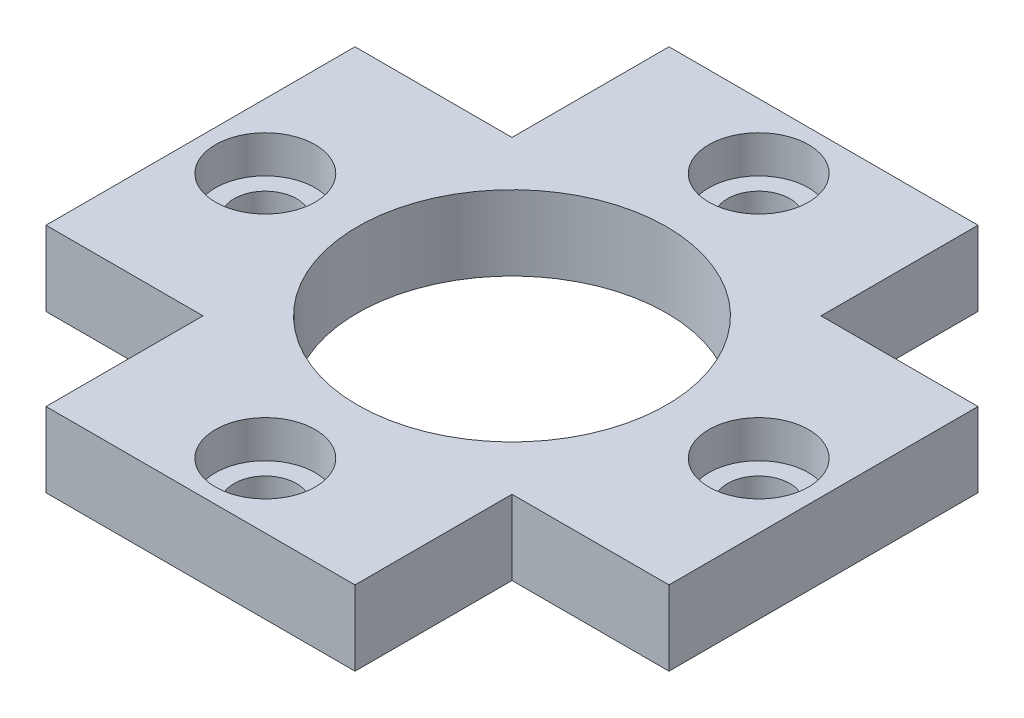
ISO-10303-21;
HEADER;
FILE_DESCRIPTION(('STEP AP214'),'2;1');
FILE_NAME('part.step','',(''),(''),'','','');
FILE_SCHEMA(('AUTOMOTIVE_DESIGN { 1 0 10303 214 1 1 1 1 }'));
ENDSEC;
DATA;
#1=APPLICATION_CONTEXT('core data for automotive mechanical design processes');
#2=APPLICATION_PROTOCOL_DEFINITION('international standard','automotive_design',2000,#1);
#3=PRODUCT_CONTEXT('',#1,'mechanical');
#4=PRODUCT('Part','Part','',(#3));
#5=PRODUCT_RELATED_PRODUCT_CATEGORY('part','',(#4));
#6=PRODUCT_DEFINITION_FORMATION('','',#4);
#7=PRODUCT_DEFINITION_CONTEXT('part definition',#1,'design');
#8=PRODUCT_DEFINITION('design','',#6,#7);
#9=PRODUCT_DEFINITION_SHAPE('','',#8);
#10=(LENGTH_UNIT() NAMED_UNIT(*) SI_UNIT(.MILLI.,.METRE.));
#11=(NAMED_UNIT(*) PLANE_ANGLE_UNIT() SI_UNIT($,.RADIAN.));
#12=(NAMED_UNIT(*) SI_UNIT($,.STERADIAN.) SOLID_ANGLE_UNIT());
#13=UNCERTAINTY_MEASURE_WITH_UNIT(LENGTH_MEASURE(1.E-05),#10,'distance_accuracy_value','');
#14=(GEOMETRIC_REPRESENTATION_CONTEXT(3) GLOBAL_UNCERTAINTY_ASSIGNED_CONTEXT((#13)) GLOBAL_UNIT_ASSIGNED_CONTEXT((#10,
#11,#12)) REPRESENTATION_CONTEXT('',''));
#15=CARTESIAN_POINT('',(0.,0.,0.));
#16=DIRECTION('',(0.,0.,1.));
#17=DIRECTION('',(1.,0.,0.));
#18=AXIS2_PLACEMENT_3D('',#15,#16,#17);
#19=CARTESIAN_POINT('',(0.,3.,-9.89949493661166));
#20=DIRECTION('',(0.,-1.,0.));
#21=DIRECTION('',(0.,0.,-1.));
#22=AXIS2_PLACEMENT_3D('',#19,#20,#21);
#23=CYLINDRICAL_SURFACE('',#22,1.25);
#24=CARTESIAN_POINT('',(0.,0.,-9.89949493661166));
#25=DIRECTION('',(0.,-1.,0.));
#26=DIRECTION('',(-1.,0.,0.));
#27=AXIS2_PLACEMENT_3D('',#24,#25,#26);
#28=CIRCLE('',#27,1.25);
#29=CARTESIAN_POINT('',(-1.25000000000002,0.,-9.89949493661168));
#30=VERTEX_POINT('',#29);
#31=EDGE_CURVE('E227',#30,#30,#28,.T.);
#32=ORIENTED_EDGE('',*,*,#31,.T.);
#33=EDGE_LOOP('',(#32));
#34=FACE_BOUND('',#33,.T.);
#35=CARTESIAN_POINT('',(0.,1.5,-9.89949493661166));
#36=DIRECTION('',(0.,1.,0.));
#37=DIRECTION('',(0.,0.,1.));
#38=AXIS2_PLACEMENT_3D('',#35,#36,#37);
#39=CIRCLE('',#38,1.25);
#40=CARTESIAN_POINT('',(0.,1.5,-8.64949493661166));
#41=VERTEX_POINT('',#40);
#42=EDGE_CURVE('E45',#41,#41,#39,.F.);
#43=ORIENTED_EDGE('',*,*,#42,.F.);
#44=EDGE_LOOP('',(#43));
#45=FACE_BOUND('',#44,.T.);
#46=ADVANCED_FACE('F41',(#34,#45),#23,.F.);
#47=CARTESIAN_POINT('',(-9.89949493661166,3.,1.21335097081698E-13));
#48=DIRECTION('',(0.,-1.,0.));
#49=DIRECTION('',(0.,0.,-1.));
#50=AXIS2_PLACEMENT_3D('',#47,#48,#49);
#51=CYLINDRICAL_SURFACE('',#50,1.25);
#52=CARTESIAN_POINT('',(-9.89949493661166,0.,1.21335097081698E-13));
#53=DIRECTION('',(0.,-1.,0.));
#54=DIRECTION('',(0.,0.,1.));
#55=AXIS2_PLACEMENT_3D('',#52,#53,#54);
#56=CIRCLE('',#55,1.25);
#57=CARTESIAN_POINT('',(-9.89949493661166,0.,1.25000000000012));
#58=VERTEX_POINT('',#57);
#59=EDGE_CURVE('E231',#58,#58,#56,.T.);
#60=ORIENTED_EDGE('',*,*,#59,.T.);
#61=EDGE_LOOP('',(#60));
#62=FACE_BOUND('',#61,.T.);
#63=CARTESIAN_POINT('',(-9.89949493661166,1.5,1.21335097081698E-13));
#64=DIRECTION('',(0.,1.,0.));
#65=DIRECTION('',(0.,0.,1.));
#66=AXIS2_PLACEMENT_3D('',#63,#64,#65);
#67=CIRCLE('',#66,1.25);
#68=CARTESIAN_POINT('',(-9.89949493661166,1.5,1.25000000000012));
#69=VERTEX_POINT('',#68);
#70=EDGE_CURVE('E221',#69,#69,#67,.F.);
#71=ORIENTED_EDGE('',*,*,#70,.F.);
#72=EDGE_LOOP('',(#71));
#73=FACE_BOUND('',#72,.T.);
#74=ADVANCED_FACE('F292',(#62,#73),#51,.F.);
#75=CARTESIAN_POINT('',(0.,3.,9.89949493661166));
#76=DIRECTION('',(0.,-1.,0.));
#77=DIRECTION('',(0.,0.,-1.));
#78=AXIS2_PLACEMENT_3D('',#75,#76,#77);
#79=CYLINDRICAL_SURFACE('',#78,1.25);
#80=CARTESIAN_POINT('',(0.,0.,9.89949493661166));
#81=DIRECTION('',(0.,-1.,0.));
#82=DIRECTION('',(1.,0.,0.));
#83=AXIS2_PLACEMENT_3D('',#80,#81,#82);
#84=CIRCLE('',#83,1.25);
#85=CARTESIAN_POINT('',(1.25000000000009,0.,9.89949493661167));
#86=VERTEX_POINT('',#85);
#87=EDGE_CURVE('E236',#86,#86,#84,.T.);
#88=ORIENTED_EDGE('',*,*,#87,.T.);
#89=EDGE_LOOP('',(#88));
#90=FACE_BOUND('',#89,.T.);
#91=CARTESIAN_POINT('',(0.,1.5,9.89949493661166));
#92=DIRECTION('',(0.,1.,0.));
#93=DIRECTION('',(0.,0.,1.));
#94=AXIS2_PLACEMENT_3D('',#91,#92,#93);
#95=CIRCLE('',#94,1.25);
#96=CARTESIAN_POINT('',(0.,1.5,11.1494949366117));
#97=VERTEX_POINT('',#96);
#98=EDGE_CURVE('E219',#97,#97,#95,.F.);
#99=ORIENTED_EDGE('',*,*,#98,.F.);
#100=EDGE_LOOP('',(#99));
#101=FACE_BOUND('',#100,.T.);
#102=ADVANCED_FACE('F297',(#90,#101),#79,.F.);
#103=CARTESIAN_POINT('',(9.89949493661166,3.,-1.21335097081698E-13));
#104=DIRECTION('',(0.,-1.,0.));
#105=DIRECTION('',(0.,0.,-1.));
#106=AXIS2_PLACEMENT_3D('',#103,#104,#105);
#107=CYLINDRICAL_SURFACE('',#106,1.25);
#108=CARTESIAN_POINT('',(9.89949493661166,0.,-1.21335097081698E-13));
#109=DIRECTION('',(0.,-1.,0.));
#110=DIRECTION('',(0.,0.,-1.));
#111=AXIS2_PLACEMENT_3D('',#108,#109,#110);
#112=CIRCLE('',#111,1.25);
#113=CARTESIAN_POINT('',(9.89949493661166,0.,-1.25000000000012));
#114=VERTEX_POINT('',#113);
#115=EDGE_CURVE('E167',#114,#114,#112,.T.);
#116=ORIENTED_EDGE('',*,*,#115,.T.);
#117=EDGE_LOOP('',(#116));
#118=FACE_BOUND('',#117,.T.);
#119=CARTESIAN_POINT('',(9.89949493661166,1.5,-1.21335097081698E-13));
#120=DIRECTION('',(0.,1.,0.));
#121=DIRECTION('',(0.,0.,1.));
#122=AXIS2_PLACEMENT_3D('',#119,#120,#121);
#123=CIRCLE('',#122,1.25);
#124=CARTESIAN_POINT('',(9.89949493661166,1.5,1.24999999999988));
#125=VERTEX_POINT('',#124);
#126=EDGE_CURVE('E215',#125,#125,#123,.F.);
#127=ORIENTED_EDGE('',*,*,#126,.F.);
#128=EDGE_LOOP('',(#127));
#129=FACE_BOUND('',#128,.T.);
#130=ADVANCED_FACE('F312',(#118,#129),#107,.F.);
#131=CARTESIAN_POINT('',(6.2,3.,0.));
#132=DIRECTION('',(-1.,0.,0.));
#133=DIRECTION('',(0.,0.,1.));
#134=AXIS2_PLACEMENT_3D('',#131,#132,#133);
#135=PLANE('',#134);
#136=DIRECTION('',(0.,0.,-1.));
#137=VECTOR('',#136,1.);
#138=CARTESIAN_POINT('',(6.2,0.,0.));
#139=LINE('',#138,#137);
#140=CARTESIAN_POINT('',(6.2,0.,12.5));
#141=VERTEX_POINT('',#140);
#142=CARTESIAN_POINT('',(6.2,0.,6.2));
#143=VERTEX_POINT('',#142);
#144=EDGE_CURVE('E166',#141,#143,#139,.T.);
#145=ORIENTED_EDGE('',*,*,#144,.T.);
#146=DIRECTION('',(0.,-1.,0.));
#147=VECTOR('',#146,1.);
#148=CARTESIAN_POINT('',(6.2,3.,6.2));
#149=LINE('',#148,#147);
#150=CARTESIAN_POINT('',(6.2,3.,6.2));
#151=VERTEX_POINT('',#150);
#152=EDGE_CURVE('E11',#151,#143,#149,.T.);
#153=ORIENTED_EDGE('',*,*,#152,.F.);
#154=DIRECTION('',(0.,0.,-1.));
#155=VECTOR('',#154,1.);
#156=CARTESIAN_POINT('',(6.2,3.,0.));
#157=LINE('',#156,#155);
#158=CARTESIAN_POINT('',(6.2,3.,12.5));
#159=VERTEX_POINT('',#158);
#160=EDGE_CURVE('E249',#159,#151,#157,.T.);
#161=ORIENTED_EDGE('',*,*,#160,.F.);
#162=DIRECTION('',(0.,-1.,0.));
#163=VECTOR('',#162,1.);
#164=CARTESIAN_POINT('',(6.2,3.,12.5));
#165=LINE('',#164,#163);
#166=EDGE_CURVE('E159',#159,#141,#165,.T.);
#167=ORIENTED_EDGE('',*,*,#166,.T.);
#168=EDGE_LOOP('',(#145,#153,#161,#167));
#169=FACE_BOUND('',#168,.T.);
#170=ADVANCED_FACE('F277',(#169),#135,.F.);
#171=CARTESIAN_POINT('',(0.,3.,6.2));
#172=DIRECTION('',(0.,0.,-1.));
#173=DIRECTION('',(-1.,0.,0.));
#174=AXIS2_PLACEMENT_3D('',#171,#172,#173);
#175=PLANE('',#174);
#176=DIRECTION('',(1.,0.,0.));
#177=VECTOR('',#176,1.);
#178=CARTESIAN_POINT('',(0.,0.,6.2));
#179=LINE('',#178,#177);
#180=CARTESIAN_POINT('',(12.5,0.,6.2));
#181=VERTEX_POINT('',#180);
#182=EDGE_CURVE('E170',#143,#181,#179,.T.);
#183=ORIENTED_EDGE('',*,*,#182,.T.);
#184=DIRECTION('',(0.,-1.,0.));
#185=VECTOR('',#184,1.);
#186=CARTESIAN_POINT('',(12.5,3.,6.2));
#187=LINE('',#186,#185);
#188=CARTESIAN_POINT('',(12.5,3.,6.2));
#189=VERTEX_POINT('',#188);
#190=EDGE_CURVE('E51',#189,#181,#187,.T.);
#191=ORIENTED_EDGE('',*,*,#190,.F.);
#192=DIRECTION('',(1.,0.,0.));
#193=VECTOR('',#192,1.);
#194=CARTESIAN_POINT('',(0.,3.,6.2));
#195=LINE('',#194,#193);
#196=EDGE_CURVE('E111',#151,#189,#195,.T.);
#197=ORIENTED_EDGE('',*,*,#196,.F.);
#198=ORIENTED_EDGE('',*,*,#152,.T.);
#199=EDGE_LOOP('',(#183,#191,#197,#198));
#200=FACE_BOUND('',#199,.T.);
#201=ADVANCED_FACE('F583',(#200),#175,.F.);
#202=CARTESIAN_POINT('',(12.5,3.,0.));
#203=DIRECTION('',(-1.,0.,0.));
#204=DIRECTION('',(0.,0.,1.));
#205=AXIS2_PLACEMENT_3D('',#202,#203,#204);
#206=PLANE('',#205);
#207=DIRECTION('',(0.,0.,-1.));
#208=VECTOR('',#207,1.);
#209=CARTESIAN_POINT('',(12.5,0.,0.));
#210=LINE('',#209,#208);
#211=CARTESIAN_POINT('',(12.5,0.,-6.2));
#212=VERTEX_POINT('',#211);
#213=EDGE_CURVE('E172',#181,#212,#210,.T.);
#214=ORIENTED_EDGE('',*,*,#213,.T.);
#215=DIRECTION('',(0.,-1.,0.));
#216=VECTOR('',#215,1.);
#217=CARTESIAN_POINT('',(12.5,3.,-6.2));
#218=LINE('',#217,#216);
#219=CARTESIAN_POINT('',(12.5,3.,-6.2));
#220=VERTEX_POINT('',#219);
#221=EDGE_CURVE('E211',#220,#212,#218,.T.);
#222=ORIENTED_EDGE('',*,*,#221,.F.);
#223=DIRECTION('',(0.,0.,-1.));
#224=VECTOR('',#223,1.);
#225=CARTESIAN_POINT('',(12.5,3.,0.));
#226=LINE('',#225,#224);
#227=EDGE_CURVE('E252',#189,#220,#226,.T.);
#228=ORIENTED_EDGE('',*,*,#227,.F.);
#229=ORIENTED_EDGE('',*,*,#190,.T.);
#230=EDGE_LOOP('',(#214,#222,#228,#229));
#231=FACE_BOUND('',#230,.T.);
#232=ADVANCED_FACE('F573',(#231),#206,.F.);
#233=CARTESIAN_POINT('',(0.,3.,-6.2));
#234=DIRECTION('',(0.,0.,-1.));
#235=DIRECTION('',(-1.,0.,0.));
#236=AXIS2_PLACEMENT_3D('',#233,#234,#235);
#237=PLANE('',#236);
#238=DIRECTION('',(1.,0.,0.));
#239=VECTOR('',#238,1.);
#240=CARTESIAN_POINT('',(0.,0.,-6.2));
#241=LINE('',#240,#239);
#242=CARTESIAN_POINT('',(6.2,0.,-6.2));
#243=VERTEX_POINT('',#242);
#244=EDGE_CURVE('E175',#243,#212,#241,.T.);
#245=ORIENTED_EDGE('',*,*,#244,.F.);
#246=DIRECTION('',(0.,-1.,0.));
#247=VECTOR('',#246,1.);
#248=CARTESIAN_POINT('',(6.2,3.,-6.2));
#249=LINE('',#248,#247);
#250=CARTESIAN_POINT('',(6.2,3.,-6.2));
#251=VERTEX_POINT('',#250);
#252=EDGE_CURVE('E209',#251,#243,#249,.T.);
#253=ORIENTED_EDGE('',*,*,#252,.F.);
#254=DIRECTION('',(1.,0.,0.));
#255=VECTOR('',#254,1.);
#256=CARTESIAN_POINT('',(0.,3.,-6.2));
#257=LINE('',#256,#255);
#258=EDGE_CURVE('E254',#251,#220,#257,.T.);
#259=ORIENTED_EDGE('',*,*,#258,.T.);
#260=ORIENTED_EDGE('',*,*,#221,.T.);
#261=EDGE_LOOP('',(#245,#253,#259,#260));
#262=FACE_BOUND('',#261,.T.);
#263=ADVANCED_FACE('F563',(#262),#237,.T.);
#264=CARTESIAN_POINT('',(6.2,3.,0.));
#265=DIRECTION('',(-1.,0.,0.));
#266=DIRECTION('',(0.,0.,1.));
#267=AXIS2_PLACEMENT_3D('',#264,#265,#266);
#268=PLANE('',#267);
#269=DIRECTION('',(0.,0.,-1.));
#270=VECTOR('',#269,1.);
#271=CARTESIAN_POINT('',(6.2,0.,0.));
#272=LINE('',#271,#270);
#273=CARTESIAN_POINT('',(6.2,0.,-12.5));
#274=VERTEX_POINT('',#273);
#275=EDGE_CURVE('E178',#243,#274,#272,.T.);
#276=ORIENTED_EDGE('',*,*,#275,.T.);
#277=DIRECTION('',(0.,-1.,0.));
#278=VECTOR('',#277,1.);
#279=CARTESIAN_POINT('',(6.2,3.,-12.5));
#280=LINE('',#279,#278);
#281=CARTESIAN_POINT('',(6.2,3.,-12.5));
#282=VERTEX_POINT('',#281);
#283=EDGE_CURVE('E207',#282,#274,#280,.T.);
#284=ORIENTED_EDGE('',*,*,#283,.F.);
#285=DIRECTION('',(0.,0.,-1.));
#286=VECTOR('',#285,1.);
#287=CARTESIAN_POINT('',(6.2,3.,0.));
#288=LINE('',#287,#286);
#289=EDGE_CURVE('E257',#251,#282,#288,.T.);
#290=ORIENTED_EDGE('',*,*,#289,.F.);
#291=ORIENTED_EDGE('',*,*,#252,.T.);
#292=EDGE_LOOP('',(#276,#284,#290,#291));
#293=FACE_BOUND('',#292,.T.);
#294=ADVANCED_FACE('F553',(#293),#268,.F.);
#295=CARTESIAN_POINT('',(0.,3.,-12.5));
#296=DIRECTION('',(0.,0.,-1.));
#297=DIRECTION('',(-1.,0.,0.));
#298=AXIS2_PLACEMENT_3D('',#295,#296,#297);
#299=PLANE('',#298);
#300=DIRECTION('',(1.,0.,0.));
#301=VECTOR('',#300,1.);
#302=CARTESIAN_POINT('',(0.,0.,-12.5));
#303=LINE('',#302,#301);
#304=CARTESIAN_POINT('',(-6.2,0.,-12.5));
#305=VERTEX_POINT('',#304);
#306=EDGE_CURVE('E181',#305,#274,#303,.T.);
#307=ORIENTED_EDGE('',*,*,#306,.F.);
#308=DIRECTION('',(0.,-1.,0.));
#309=VECTOR('',#308,1.);
#310=CARTESIAN_POINT('',(-6.2,3.,-12.5));
#311=LINE('',#310,#309);
#312=CARTESIAN_POINT('',(-6.2,3.,-12.5));
#313=VERTEX_POINT('',#312);
#314=EDGE_CURVE('E205',#313,#305,#311,.T.);
#315=ORIENTED_EDGE('',*,*,#314,.F.);
#316=DIRECTION('',(1.,0.,0.));
#317=VECTOR('',#316,1.);
#318=CARTESIAN_POINT('',(0.,3.,-12.5));
#319=LINE('',#318,#317);
#320=EDGE_CURVE('E259',#313,#282,#319,.T.);
#321=ORIENTED_EDGE('',*,*,#320,.T.);
#322=ORIENTED_EDGE('',*,*,#283,.T.);
#323=EDGE_LOOP('',(#307,#315,#321,#322));
#324=FACE_BOUND('',#323,.T.);
#325=ADVANCED_FACE('F543',(#324),#299,.T.);
#326=CARTESIAN_POINT('',(-6.2,3.,0.));
#327=DIRECTION('',(-1.,0.,0.));
#328=DIRECTION('',(0.,0.,1.));
#329=AXIS2_PLACEMENT_3D('',#326,#327,#328);
#330=PLANE('',#329);
#331=DIRECTION('',(0.,0.,-1.));
#332=VECTOR('',#331,1.);
#333=CARTESIAN_POINT('',(-6.2,0.,0.));
#334=LINE('',#333,#332);
#335=CARTESIAN_POINT('',(-6.2,0.,-6.2));
#336=VERTEX_POINT('',#335);
#337=EDGE_CURVE('E184',#336,#305,#334,.T.);
#338=ORIENTED_EDGE('',*,*,#337,.F.);
#339=DIRECTION('',(0.,-1.,0.));
#340=VECTOR('',#339,1.);
#341=CARTESIAN_POINT('',(-6.2,3.,-6.2));
#342=LINE('',#341,#340);
#343=CARTESIAN_POINT('',(-6.2,3.,-6.2));
#344=VERTEX_POINT('',#343);
#345=EDGE_CURVE('E203',#344,#336,#342,.T.);
#346=ORIENTED_EDGE('',*,*,#345,.F.);
#347=DIRECTION('',(0.,0.,-1.));
#348=VECTOR('',#347,1.);
#349=CARTESIAN_POINT('',(-6.2,3.,0.));
#350=LINE('',#349,#348);
#351=EDGE_CURVE('E262',#344,#313,#350,.T.);
#352=ORIENTED_EDGE('',*,*,#351,.T.);
#353=ORIENTED_EDGE('',*,*,#314,.T.);
#354=EDGE_LOOP('',(#338,#346,#352,#353));
#355=FACE_BOUND('',#354,.T.);
#356=ADVANCED_FACE('F533',(#355),#330,.T.);
#357=CARTESIAN_POINT('',(0.,3.,-6.2));
#358=DIRECTION('',(0.,0.,-1.));
#359=DIRECTION('',(-1.,0.,0.));
#360=AXIS2_PLACEMENT_3D('',#357,#358,#359);
#361=PLANE('',#360);
#362=DIRECTION('',(1.,0.,0.));
#363=VECTOR('',#362,1.);
#364=CARTESIAN_POINT('',(0.,0.,-6.2));
#365=LINE('',#364,#363);
#366=CARTESIAN_POINT('',(-12.5,0.,-6.2));
#367=VERTEX_POINT('',#366);
#368=EDGE_CURVE('E187',#367,#336,#365,.T.);
#369=ORIENTED_EDGE('',*,*,#368,.F.);
#370=DIRECTION('',(0.,-1.,0.));
#371=VECTOR('',#370,1.);
#372=CARTESIAN_POINT('',(-12.5,3.,-6.2));
#373=LINE('',#372,#371);
#374=CARTESIAN_POINT('',(-12.5,3.,-6.2));
#375=VERTEX_POINT('',#374);
#376=EDGE_CURVE('E201',#375,#367,#373,.T.);
#377=ORIENTED_EDGE('',*,*,#376,.F.);
#378=DIRECTION('',(1.,0.,0.));
#379=VECTOR('',#378,1.);
#380=CARTESIAN_POINT('',(0.,3.,-6.2));
#381=LINE('',#380,#379);
#382=EDGE_CURVE('E265',#375,#344,#381,.T.);
#383=ORIENTED_EDGE('',*,*,#382,.T.);
#384=ORIENTED_EDGE('',*,*,#345,.T.);
#385=EDGE_LOOP('',(#369,#377,#383,#384));
#386=FACE_BOUND('',#385,.T.);
#387=ADVANCED_FACE('F524',(#386),#361,.T.);
#388=CARTESIAN_POINT('',(-12.5,3.,0.));
#389=DIRECTION('',(-1.,0.,0.));
#390=DIRECTION('',(0.,0.,1.));
#391=AXIS2_PLACEMENT_3D('',#388,#389,#390);
#392=PLANE('',#391);
#393=DIRECTION('',(0.,0.,-1.));
#394=VECTOR('',#393,1.);
#395=CARTESIAN_POINT('',(-12.5,0.,0.));
#396=LINE('',#395,#394);
#397=CARTESIAN_POINT('',(-12.5,0.,6.2));
#398=VERTEX_POINT('',#397);
#399=EDGE_CURVE('E190',#398,#367,#396,.T.);
#400=ORIENTED_EDGE('',*,*,#399,.F.);
#401=DIRECTION('',(0.,-1.,0.));
#402=VECTOR('',#401,1.);
#403=CARTESIAN_POINT('',(-12.5,3.,6.2));
#404=LINE('',#403,#402);
#405=CARTESIAN_POINT('',(-12.5,3.,6.2));
#406=VERTEX_POINT('',#405);
#407=EDGE_CURVE('E155',#406,#398,#404,.T.);
#408=ORIENTED_EDGE('',*,*,#407,.F.);
#409=DIRECTION('',(0.,0.,-1.));
#410=VECTOR('',#409,1.);
#411=CARTESIAN_POINT('',(-12.5,3.,0.));
#412=LINE('',#411,#410);
#413=EDGE_CURVE('E144',#406,#375,#412,.T.);
#414=ORIENTED_EDGE('',*,*,#413,.T.);
#415=ORIENTED_EDGE('',*,*,#376,.T.);
#416=EDGE_LOOP('',(#400,#408,#414,#415));
#417=FACE_BOUND('',#416,.T.);
#418=ADVANCED_FACE('F269',(#417),#392,.T.);
#419=CARTESIAN_POINT('',(0.,3.,6.2));
#420=DIRECTION('',(0.,0.,-1.));
#421=DIRECTION('',(-1.,0.,0.));
#422=AXIS2_PLACEMENT_3D('',#419,#420,#421);
#423=PLANE('',#422);
#424=DIRECTION('',(1.,0.,0.));
#425=VECTOR('',#424,1.);
#426=CARTESIAN_POINT('',(0.,0.,6.2));
#427=LINE('',#426,#425);
#428=CARTESIAN_POINT('',(-6.2,0.,6.2));
#429=VERTEX_POINT('',#428);
#430=EDGE_CURVE('E151',#398,#429,#427,.T.);
#431=ORIENTED_EDGE('',*,*,#430,.T.);
#432=DIRECTION('',(0.,-1.,0.));
#433=VECTOR('',#432,1.);
#434=CARTESIAN_POINT('',(-6.2,3.,6.2));
#435=LINE('',#434,#433);
#436=CARTESIAN_POINT('',(-6.2,3.,6.2));
#437=VERTEX_POINT('',#436);
#438=EDGE_CURVE('E148',#437,#429,#435,.T.);
#439=ORIENTED_EDGE('',*,*,#438,.F.);
#440=DIRECTION('',(1.,0.,0.));
#441=VECTOR('',#440,1.);
#442=CARTESIAN_POINT('',(0.,3.,6.2));
#443=LINE('',#442,#441);
#444=EDGE_CURVE('E137',#406,#437,#443,.T.);
#445=ORIENTED_EDGE('',*,*,#444,.F.);
#446=ORIENTED_EDGE('',*,*,#407,.T.);
#447=EDGE_LOOP('',(#431,#439,#445,#446));
#448=FACE_BOUND('',#447,.T.);
#449=ADVANCED_FACE('F149',(#448),#423,.F.);
#450=CARTESIAN_POINT('',(-6.2,3.,0.));
#451=DIRECTION('',(-1.,0.,0.));
#452=DIRECTION('',(0.,0.,1.));
#453=AXIS2_PLACEMENT_3D('',#450,#451,#452);
#454=PLANE('',#453);
#455=DIRECTION('',(0.,0.,-1.));
#456=VECTOR('',#455,1.);
#457=CARTESIAN_POINT('',(-6.2,0.,0.));
#458=LINE('',#457,#456);
#459=CARTESIAN_POINT('',(-6.2,0.,12.5));
#460=VERTEX_POINT('',#459);
#461=EDGE_CURVE('E194',#460,#429,#458,.T.);
#462=ORIENTED_EDGE('',*,*,#461,.F.);
#463=DIRECTION('',(0.,-1.,0.));
#464=VECTOR('',#463,1.);
#465=CARTESIAN_POINT('',(-6.2,3.,12.5));
#466=LINE('',#465,#464);
#467=CARTESIAN_POINT('',(-6.2,3.,12.5));
#468=VERTEX_POINT('',#467);
#469=EDGE_CURVE('E100',#468,#460,#466,.T.);
#470=ORIENTED_EDGE('',*,*,#469,.F.);
#471=DIRECTION('',(0.,0.,-1.));
#472=VECTOR('',#471,1.);
#473=CARTESIAN_POINT('',(-6.2,3.,0.));
#474=LINE('',#473,#472);
#475=EDGE_CURVE('E141',#468,#437,#474,.T.);
#476=ORIENTED_EDGE('',*,*,#475,.T.);
#477=ORIENTED_EDGE('',*,*,#438,.T.);
#478=EDGE_LOOP('',(#462,#470,#476,#477));
#479=FACE_BOUND('',#478,.T.);
#480=ADVANCED_FACE('F157',(#479),#454,.T.);
#481=CARTESIAN_POINT('',(0.,3.,0.));
#482=DIRECTION('',(0.,-1.,0.));
#483=DIRECTION('',(0.,0.,-1.));
#484=AXIS2_PLACEMENT_3D('',#481,#482,#483);
#485=CYLINDRICAL_SURFACE('',#484,6.2);
#486=CARTESIAN_POINT('',(0.,3.,0.));
#487=DIRECTION('',(0.,1.,0.));
#488=DIRECTION('',(0.,0.,1.));
#489=AXIS2_PLACEMENT_3D('',#486,#487,#488);
#490=CIRCLE('',#489,6.2);
#491=CARTESIAN_POINT('',(0.,3.,6.2));
#492=VERTEX_POINT('',#491);
#493=EDGE_CURVE('E197',#492,#492,#490,.T.);
#494=ORIENTED_EDGE('',*,*,#493,.T.);
#495=EDGE_LOOP('',(#494));
#496=FACE_BOUND('',#495,.T.);
#497=CARTESIAN_POINT('',(0.,0.,0.));
#498=DIRECTION('',(0.,1.,0.));
#499=DIRECTION('',(0.,0.,1.));
#500=AXIS2_PLACEMENT_3D('',#497,#498,#499);
#501=CIRCLE('',#500,6.2);
#502=CARTESIAN_POINT('',(0.,0.,6.2));
#503=VERTEX_POINT('',#502);
#504=EDGE_CURVE('E163',#503,#503,#501,.T.);
#505=ORIENTED_EDGE('',*,*,#504,.F.);
#506=EDGE_LOOP('',(#505));
#507=FACE_BOUND('',#506,.T.);
#508=ADVANCED_FACE('F43',(#496,#507),#485,.F.);
#509=CARTESIAN_POINT('',(0.,3.,12.5));
#510=DIRECTION('',(0.,0.,-1.));
#511=DIRECTION('',(-1.,0.,0.));
#512=AXIS2_PLACEMENT_3D('',#509,#510,#511);
#513=PLANE('',#512);
#514=DIRECTION('',(1.,0.,0.));
#515=VECTOR('',#514,1.);
#516=CARTESIAN_POINT('',(0.,0.,12.5));
#517=LINE('',#516,#515);
#518=EDGE_CURVE('E103',#460,#141,#517,.T.);
#519=ORIENTED_EDGE('',*,*,#518,.T.);
#520=ORIENTED_EDGE('',*,*,#166,.F.);
#521=DIRECTION('',(1.,0.,0.));
#522=VECTOR('',#521,1.);
#523=CARTESIAN_POINT('',(0.,3.,12.5));
#524=LINE('',#523,#522);
#525=EDGE_CURVE('E60',#468,#159,#524,.T.);
#526=ORIENTED_EDGE('',*,*,#525,.F.);
#527=ORIENTED_EDGE('',*,*,#469,.T.);
#528=EDGE_LOOP('',(#519,#520,#526,#527));
#529=FACE_BOUND('',#528,.T.);
#530=ADVANCED_FACE('F279',(#529),#513,.F.);
#531=CARTESIAN_POINT('',(0.,3.,0.));
#532=DIRECTION('',(0.,1.,0.));
#533=DIRECTION('',(0.,0.,1.));
#534=AXIS2_PLACEMENT_3D('',#531,#532,#533);
#535=PLANE('',#534);
#536=CARTESIAN_POINT('',(0.,3.,9.89949493661166));
#537=DIRECTION('',(0.,1.,0.));
#538=DIRECTION('',(0.,0.,1.));
#539=AXIS2_PLACEMENT_3D('',#536,#537,#538);
#540=CIRCLE('',#539,2.);
#541=CARTESIAN_POINT('',(0.,3.,11.8994949366117));
#542=VERTEX_POINT('',#541);
#543=EDGE_CURVE('E347',#542,#542,#540,.T.);
#544=ORIENTED_EDGE('',*,*,#543,.F.);
#545=EDGE_LOOP('',(#544));
#546=FACE_BOUND('',#545,.T.);
#547=CARTESIAN_POINT('',(-9.89949493661166,3.,1.21335097081698E-13));
#548=DIRECTION('',(0.,1.,0.));
#549=DIRECTION('',(0.,0.,1.));
#550=AXIS2_PLACEMENT_3D('',#547,#548,#549);
#551=CIRCLE('',#550,2.);
#552=CARTESIAN_POINT('',(-9.89949493661166,3.,2.00000000000012));
#553=VERTEX_POINT('',#552);
#554=EDGE_CURVE('E341',#553,#553,#551,.T.);
#555=ORIENTED_EDGE('',*,*,#554,.F.);
#556=EDGE_LOOP('',(#555));
#557=FACE_BOUND('',#556,.T.);
#558=CARTESIAN_POINT('',(0.,3.,-9.89949493661166));
#559=DIRECTION('',(0.,1.,0.));
#560=DIRECTION('',(0.,0.,1.));
#561=AXIS2_PLACEMENT_3D('',#558,#559,#560);
#562=CIRCLE('',#561,2.);
#563=CARTESIAN_POINT('',(0.,3.,-7.89949493661166));
#564=VERTEX_POINT('',#563);
#565=EDGE_CURVE('E335',#564,#564,#562,.T.);
#566=ORIENTED_EDGE('',*,*,#565,.F.);
#567=EDGE_LOOP('',(#566));
#568=FACE_BOUND('',#567,.T.);
#569=CARTESIAN_POINT('',(9.89949493661166,3.,-1.21335097081698E-13));
#570=DIRECTION('',(0.,1.,0.));
#571=DIRECTION('',(0.,0.,1.));
#572=AXIS2_PLACEMENT_3D('',#569,#570,#571);
#573=CIRCLE('',#572,2.);
#574=CARTESIAN_POINT('',(9.89949493661166,3.,1.99999999999988));
#575=VERTEX_POINT('',#574);
#576=EDGE_CURVE('E242',#575,#575,#573,.T.);
#577=ORIENTED_EDGE('',*,*,#576,.F.);
#578=EDGE_LOOP('',(#577));
#579=FACE_BOUND('',#578,.T.);
#580=ORIENTED_EDGE('',*,*,#493,.F.);
#581=EDGE_LOOP('',(#580));
#582=FACE_BOUND('',#581,.T.);
#583=ORIENTED_EDGE('',*,*,#160,.T.);
#584=ORIENTED_EDGE('',*,*,#196,.T.);
#585=ORIENTED_EDGE('',*,*,#227,.T.);
#586=ORIENTED_EDGE('',*,*,#258,.F.);
#587=ORIENTED_EDGE('',*,*,#289,.T.);
#588=ORIENTED_EDGE('',*,*,#320,.F.);
#589=ORIENTED_EDGE('',*,*,#351,.F.);
#590=ORIENTED_EDGE('',*,*,#382,.F.);
#591=ORIENTED_EDGE('',*,*,#413,.F.);
#592=ORIENTED_EDGE('',*,*,#444,.T.);
#593=ORIENTED_EDGE('',*,*,#475,.F.);
#594=ORIENTED_EDGE('',*,*,#525,.T.);
#595=EDGE_LOOP('',(#583,#584,#585,#586,#587,#588,#589,#590,#591,#592,#593,#594));
#596=FACE_BOUND('',#595,.T.);
#597=ADVANCED_FACE('F139',(#546,#557,#568,#579,#582,#596),#535,.T.);
#598=CARTESIAN_POINT('',(0.,0.,0.));
#599=DIRECTION('',(0.,1.,0.));
#600=DIRECTION('',(0.,0.,1.));
#601=AXIS2_PLACEMENT_3D('',#598,#599,#600);
#602=PLANE('',#601);
#603=ORIENTED_EDGE('',*,*,#87,.F.);
#604=EDGE_LOOP('',(#603));
#605=FACE_BOUND('',#604,.T.);
#606=ORIENTED_EDGE('',*,*,#59,.F.);
#607=EDGE_LOOP('',(#606));
#608=FACE_BOUND('',#607,.T.);
#609=ORIENTED_EDGE('',*,*,#31,.F.);
#610=EDGE_LOOP('',(#609));
#611=FACE_BOUND('',#610,.T.);
#612=ORIENTED_EDGE('',*,*,#115,.F.);
#613=EDGE_LOOP('',(#612));
#614=FACE_BOUND('',#613,.T.);
#615=ORIENTED_EDGE('',*,*,#504,.T.);
#616=EDGE_LOOP('',(#615));
#617=FACE_BOUND('',#616,.T.);
#618=ORIENTED_EDGE('',*,*,#144,.F.);
#619=ORIENTED_EDGE('',*,*,#518,.F.);
#620=ORIENTED_EDGE('',*,*,#461,.T.);
#621=ORIENTED_EDGE('',*,*,#430,.F.);
#622=ORIENTED_EDGE('',*,*,#399,.T.);
#623=ORIENTED_EDGE('',*,*,#368,.T.);
#624=ORIENTED_EDGE('',*,*,#337,.T.);
#625=ORIENTED_EDGE('',*,*,#306,.T.);
#626=ORIENTED_EDGE('',*,*,#275,.F.);
#627=ORIENTED_EDGE('',*,*,#244,.T.);
#628=ORIENTED_EDGE('',*,*,#213,.F.);
#629=ORIENTED_EDGE('',*,*,#182,.F.);
#630=EDGE_LOOP('',(#618,#619,#620,#621,#622,#623,#624,#625,#626,#627,#628,#629));
#631=FACE_BOUND('',#630,.T.);
#632=ADVANCED_FACE('F273',(#605,#608,#611,#614,#617,#631),#602,.F.);
#633=CARTESIAN_POINT('',(9.89949493661166,1.5,-1.21335097081698E-13));
#634=DIRECTION('',(0.,1.,0.));
#635=DIRECTION('',(0.,0.,1.));
#636=AXIS2_PLACEMENT_3D('',#633,#634,#635);
#637=PLANE('',#636);
#638=CARTESIAN_POINT('',(9.89949493661166,1.5,-1.21335097081698E-13));
#639=DIRECTION('',(0.,1.,0.));
#640=DIRECTION('',(0.,0.,1.));
#641=AXIS2_PLACEMENT_3D('',#638,#639,#640);
#642=CIRCLE('',#641,2.);
#643=CARTESIAN_POINT('',(9.89949493661166,1.5,1.99999999999988));
#644=VERTEX_POINT('',#643);
#645=EDGE_CURVE('E218',#644,#644,#642,.T.);
#646=ORIENTED_EDGE('',*,*,#645,.T.);
#647=EDGE_LOOP('',(#646));
#648=FACE_BOUND('',#647,.T.);
#649=ORIENTED_EDGE('',*,*,#126,.T.);
#650=EDGE_LOOP('',(#649));
#651=FACE_BOUND('',#650,.T.);
#652=ADVANCED_FACE('F303',(#648,#651),#637,.T.);
#653=CARTESIAN_POINT('',(9.89949493661166,1.5,-1.21335097081698E-13));
#654=DIRECTION('',(0.,1.,0.));
#655=DIRECTION('',(0.,0.,1.));
#656=AXIS2_PLACEMENT_3D('',#653,#654,#655);
#657=CYLINDRICAL_SURFACE('',#656,2.);
#658=ORIENTED_EDGE('',*,*,#645,.F.);
#659=EDGE_LOOP('',(#658));
#660=FACE_BOUND('',#659,.T.);
#661=ORIENTED_EDGE('',*,*,#576,.T.);
#662=EDGE_LOOP('',(#661));
#663=FACE_BOUND('',#662,.T.);
#664=ADVANCED_FACE('F306',(#660,#663),#657,.F.);
#665=CARTESIAN_POINT('',(0.,1.5,9.89949493661166));
#666=DIRECTION('',(0.,1.,0.));
#667=DIRECTION('',(0.,0.,1.));
#668=AXIS2_PLACEMENT_3D('',#665,#666,#667);
#669=PLANE('',#668);
#670=CARTESIAN_POINT('',(0.,1.5,9.89949493661166));
#671=DIRECTION('',(0.,1.,0.));
#672=DIRECTION('',(0.,0.,1.));
#673=AXIS2_PLACEMENT_3D('',#670,#671,#672);
#674=CIRCLE('',#673,2.);
#675=CARTESIAN_POINT('',(0.,1.5,11.8994949366117));
#676=VERTEX_POINT('',#675);
#677=EDGE_CURVE('E222',#676,#676,#674,.T.);
#678=ORIENTED_EDGE('',*,*,#677,.T.);
#679=EDGE_LOOP('',(#678));
#680=FACE_BOUND('',#679,.T.);
#681=ORIENTED_EDGE('',*,*,#98,.T.);
#682=EDGE_LOOP('',(#681));
#683=FACE_BOUND('',#682,.T.);
#684=ADVANCED_FACE('F310',(#680,#683),#669,.T.);
#685=CARTESIAN_POINT('',(0.,1.5,9.89949493661166));
#686=DIRECTION('',(0.,1.,0.));
#687=DIRECTION('',(0.,0.,1.));
#688=AXIS2_PLACEMENT_3D('',#685,#686,#687);
#689=CYLINDRICAL_SURFACE('',#688,2.);
#690=ORIENTED_EDGE('',*,*,#677,.F.);
#691=EDGE_LOOP('',(#690));
#692=FACE_BOUND('',#691,.T.);
#693=ORIENTED_EDGE('',*,*,#543,.T.);
#694=EDGE_LOOP('',(#693));
#695=FACE_BOUND('',#694,.T.);
#696=ADVANCED_FACE('F355',(#692,#695),#689,.F.);
#697=CARTESIAN_POINT('',(-9.89949493661166,1.5,1.21335097081698E-13));
#698=DIRECTION('',(0.,1.,0.));
#699=DIRECTION('',(0.,0.,1.));
#700=AXIS2_PLACEMENT_3D('',#697,#698,#699);
#701=PLANE('',#700);
#702=CARTESIAN_POINT('',(-9.89949493661166,1.5,1.21335097081698E-13));
#703=DIRECTION('',(0.,1.,0.));
#704=DIRECTION('',(0.,0.,1.));
#705=AXIS2_PLACEMENT_3D('',#702,#703,#704);
#706=CIRCLE('',#705,2.);
#707=CARTESIAN_POINT('',(-9.89949493661166,1.5,2.00000000000012));
#708=VERTEX_POINT('',#707);
#709=EDGE_CURVE('E344',#708,#708,#706,.T.);
#710=ORIENTED_EDGE('',*,*,#709,.T.);
#711=EDGE_LOOP('',(#710));
#712=FACE_BOUND('',#711,.T.);
#713=ORIENTED_EDGE('',*,*,#70,.T.);
#714=EDGE_LOOP('',(#713));
#715=FACE_BOUND('',#714,.T.);
#716=ADVANCED_FACE('F358',(#712,#715),#701,.T.);
#717=CARTESIAN_POINT('',(-9.89949493661166,1.5,1.21335097081698E-13));
#718=DIRECTION('',(0.,1.,0.));
#719=DIRECTION('',(0.,0.,1.));
#720=AXIS2_PLACEMENT_3D('',#717,#718,#719);
#721=CYLINDRICAL_SURFACE('',#720,2.);
#722=ORIENTED_EDGE('',*,*,#709,.F.);
#723=EDGE_LOOP('',(#722));
#724=FACE_BOUND('',#723,.T.);
#725=ORIENTED_EDGE('',*,*,#554,.T.);
#726=EDGE_LOOP('',(#725));
#727=FACE_BOUND('',#726,.T.);
#728=ADVANCED_FACE('F379',(#724,#727),#721,.F.);
#729=CARTESIAN_POINT('',(0.,1.5,-9.89949493661166));
#730=DIRECTION('',(0.,1.,0.));
#731=DIRECTION('',(0.,0.,1.));
#732=AXIS2_PLACEMENT_3D('',#729,#730,#731);
#733=PLANE('',#732);
#734=CARTESIAN_POINT('',(0.,1.5,-9.89949493661166));
#735=DIRECTION('',(0.,1.,0.));
#736=DIRECTION('',(0.,0.,1.));
#737=AXIS2_PLACEMENT_3D('',#734,#735,#736);
#738=CIRCLE('',#737,2.);
#739=CARTESIAN_POINT('',(0.,1.5,-7.89949493661166));
#740=VERTEX_POINT('',#739);
#741=EDGE_CURVE('E338',#740,#740,#738,.T.);
#742=ORIENTED_EDGE('',*,*,#741,.T.);
#743=EDGE_LOOP('',(#742));
#744=FACE_BOUND('',#743,.T.);
#745=ORIENTED_EDGE('',*,*,#42,.T.);
#746=EDGE_LOOP('',(#745));
#747=FACE_BOUND('',#746,.T.);
#748=ADVANCED_FACE('F373',(#744,#747),#733,.T.);
#749=CARTESIAN_POINT('',(0.,1.5,-9.89949493661166));
#750=DIRECTION('',(0.,1.,0.));
#751=DIRECTION('',(0.,0.,1.));
#752=AXIS2_PLACEMENT_3D('',#749,#750,#751);
#753=CYLINDRICAL_SURFACE('',#752,2.);
#754=ORIENTED_EDGE('',*,*,#741,.F.);
#755=EDGE_LOOP('',(#754));
#756=FACE_BOUND('',#755,.T.);
#757=ORIENTED_EDGE('',*,*,#565,.T.);
#758=EDGE_LOOP('',(#757));
#759=FACE_BOUND('',#758,.T.);
#760=ADVANCED_FACE('F371',(#756,#759),#753,.F.);
#761=CLOSED_SHELL('',(#46,#74,#102,#130,#170,#201,#232,#263,#294,#325,#356,#387,#418,#449,#480,
#508,#530,#597,#632,#652,#664,#684,#696,#716,#728,#748,#760));
#762=MANIFOLD_SOLID_BREP('B2',#761);
#763=ADVANCED_BREP_SHAPE_REPRESENTATION('',(#18,#762),#14);
#764=SHAPE_DEFINITION_REPRESENTATION(#9,#763);
ENDSEC;
END-ISO-10303-21;
